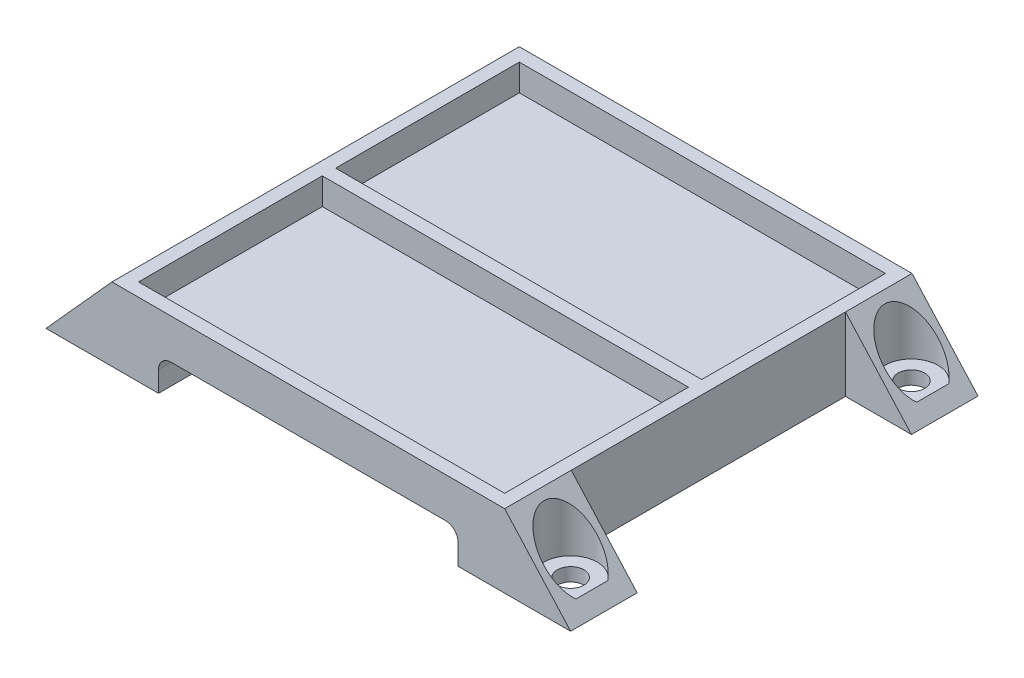
ISO-10303-21;
HEADER;
FILE_DESCRIPTION(('STEP AP214'),'2;1');
FILE_NAME('part.step','',(''),(''),'','','');
FILE_SCHEMA(('AUTOMOTIVE_DESIGN { 1 0 10303 214 1 1 1 1 }'));
ENDSEC;
DATA;
#1=APPLICATION_CONTEXT('core data for automotive mechanical design processes');
#2=APPLICATION_PROTOCOL_DEFINITION('international standard','automotive_design',2000,#1);
#3=PRODUCT_CONTEXT('',#1,'mechanical');
#4=PRODUCT('Part','Part','',(#3));
#5=PRODUCT_RELATED_PRODUCT_CATEGORY('part','',(#4));
#6=PRODUCT_DEFINITION_FORMATION('','',#4);
#7=PRODUCT_DEFINITION_CONTEXT('part definition',#1,'design');
#8=PRODUCT_DEFINITION('design','',#6,#7);
#9=PRODUCT_DEFINITION_SHAPE('','',#8);
#10=(LENGTH_UNIT() NAMED_UNIT(*) SI_UNIT(.MILLI.,.METRE.));
#11=(NAMED_UNIT(*) PLANE_ANGLE_UNIT() SI_UNIT($,.RADIAN.));
#12=(NAMED_UNIT(*) SI_UNIT($,.STERADIAN.) SOLID_ANGLE_UNIT());
#13=UNCERTAINTY_MEASURE_WITH_UNIT(LENGTH_MEASURE(1.E-05),#10,'distance_accuracy_value','');
#14=(GEOMETRIC_REPRESENTATION_CONTEXT(3) GLOBAL_UNCERTAINTY_ASSIGNED_CONTEXT((#13)) GLOBAL_UNIT_ASSIGNED_CONTEXT((#10,
#11,#12)) REPRESENTATION_CONTEXT('',''));
#15=CARTESIAN_POINT('',(0.,0.,0.));
#16=DIRECTION('',(0.,0.,1.));
#17=DIRECTION('',(1.,0.,0.));
#18=AXIS2_PLACEMENT_3D('',#15,#16,#17);
#19=CARTESIAN_POINT('',(-37.465,5.08,0.));
#20=DIRECTION('',(-1.,0.,0.));
#21=DIRECTION('',(0.,0.,1.));
#22=AXIS2_PLACEMENT_3D('',#19,#20,#21);
#23=PLANE('',#22);
#24=DIRECTION('',(0.,0.,-1.));
#25=VECTOR('',#24,1.);
#26=CARTESIAN_POINT('',(-37.465,-8.89,20.066));
#27=LINE('',#26,#25);
#28=CARTESIAN_POINT('',(-37.465,-8.89,7.366));
#29=VERTEX_POINT('',#28);
#30=CARTESIAN_POINT('',(-37.465,-8.89,-44.958));
#31=VERTEX_POINT('',#30);
#32=EDGE_CURVE('E462',#29,#31,#27,.T.);
#33=ORIENTED_EDGE('',*,*,#32,.F.);
#34=DIRECTION('',(0.,-1.,0.));
#35=VECTOR('',#34,1.);
#36=CARTESIAN_POINT('',(-37.465,-8.89,7.366));
#37=LINE('',#36,#35);
#38=CARTESIAN_POINT('',(-37.465,5.08,7.366));
#39=VERTEX_POINT('',#38);
#40=EDGE_CURVE('E442',#39,#29,#37,.T.);
#41=ORIENTED_EDGE('',*,*,#40,.F.);
#42=DIRECTION('',(0.,0.,-1.));
#43=VECTOR('',#42,1.);
#44=CARTESIAN_POINT('',(-37.465,5.08,0.));
#45=LINE('',#44,#43);
#46=CARTESIAN_POINT('',(-37.465,5.08,-44.958));
#47=VERTEX_POINT('',#46);
#48=EDGE_CURVE('E299',#39,#47,#45,.T.);
#49=ORIENTED_EDGE('',*,*,#48,.T.);
#50=DIRECTION('',(0.,1.,0.));
#51=VECTOR('',#50,1.);
#52=CARTESIAN_POINT('',(-37.465,5.08,-44.958));
#53=LINE('',#52,#51);
#54=EDGE_CURVE('E447',#31,#47,#53,.T.);
#55=ORIENTED_EDGE('',*,*,#54,.F.);
#56=EDGE_LOOP('',(#33,#41,#49,#55));
#57=FACE_BOUND('',#56,.T.);
#58=ADVANCED_FACE('F38',(#57),#23,.T.);
#59=CARTESIAN_POINT('',(37.465,5.08,0.));
#60=DIRECTION('',(-1.,0.,0.));
#61=DIRECTION('',(0.,0.,1.));
#62=AXIS2_PLACEMENT_3D('',#59,#60,#61);
#63=PLANE('',#62);
#64=DIRECTION('',(0.,1.,0.));
#65=VECTOR('',#64,1.);
#66=CARTESIAN_POINT('',(37.465,-8.89,7.366));
#67=LINE('',#66,#65);
#68=CARTESIAN_POINT('',(37.465,-8.89,7.366));
#69=VERTEX_POINT('',#68);
#70=CARTESIAN_POINT('',(37.465,5.08,7.366));
#71=VERTEX_POINT('',#70);
#72=EDGE_CURVE('E452',#69,#71,#67,.T.);
#73=ORIENTED_EDGE('',*,*,#72,.F.);
#74=DIRECTION('',(0.,0.,1.));
#75=VECTOR('',#74,1.);
#76=CARTESIAN_POINT('',(37.465,-8.89,20.066));
#77=LINE('',#76,#75);
#78=CARTESIAN_POINT('',(37.465,-8.89,-44.958));
#79=VERTEX_POINT('',#78);
#80=EDGE_CURVE('E478',#79,#69,#77,.T.);
#81=ORIENTED_EDGE('',*,*,#80,.F.);
#82=DIRECTION('',(0.,-1.,0.));
#83=VECTOR('',#82,1.);
#84=CARTESIAN_POINT('',(37.465,-8.89,-44.958));
#85=LINE('',#84,#83);
#86=CARTESIAN_POINT('',(37.465,5.08,-44.958));
#87=VERTEX_POINT('',#86);
#88=EDGE_CURVE('E457',#87,#79,#85,.T.);
#89=ORIENTED_EDGE('',*,*,#88,.F.);
#90=DIRECTION('',(0.,0.,-1.));
#91=VECTOR('',#90,1.);
#92=CARTESIAN_POINT('',(37.465,5.08,0.));
#93=LINE('',#92,#91);
#94=EDGE_CURVE('E293',#71,#87,#93,.T.);
#95=ORIENTED_EDGE('',*,*,#94,.F.);
#96=EDGE_LOOP('',(#73,#81,#89,#95));
#97=FACE_BOUND('',#96,.T.);
#98=ADVANCED_FACE('F505',(#97),#63,.F.);
#99=CARTESIAN_POINT('',(0.,-2.54,0.));
#100=DIRECTION('',(0.,1.,0.));
#101=DIRECTION('',(0.,0.,1.));
#102=AXIS2_PLACEMENT_3D('',#99,#100,#101);
#103=PLANE('',#102);
#104=DIRECTION('',(-1.,0.,0.));
#105=VECTOR('',#104,1.);
#106=CARTESIAN_POINT('',(-37.465,-2.54,20.066));
#107=LINE('',#106,#105);
#108=CARTESIAN_POINT('',(26.195,-2.54,20.066));
#109=VERTEX_POINT('',#108);
#110=CARTESIAN_POINT('',(-26.195,-2.54,20.066));
#111=VERTEX_POINT('',#110);
#112=EDGE_CURVE('E275',#109,#111,#107,.T.);
#113=ORIENTED_EDGE('',*,*,#112,.T.);
#114=DIRECTION('',(0.,0.,1.));
#115=VECTOR('',#114,1.);
#116=CARTESIAN_POINT('',(-26.195,-2.54,-57.658));
#117=LINE('',#116,#115);
#118=CARTESIAN_POINT('',(-26.195,-2.54,-57.658));
#119=VERTEX_POINT('',#118);
#120=EDGE_CURVE('E253',#111,#119,#117,.F.);
#121=ORIENTED_EDGE('',*,*,#120,.T.);
#122=DIRECTION('',(1.,0.,0.));
#123=VECTOR('',#122,1.);
#124=CARTESIAN_POINT('',(-37.465,-2.54,-57.658));
#125=LINE('',#124,#123);
#126=CARTESIAN_POINT('',(26.195,-2.54,-57.658));
#127=VERTEX_POINT('',#126);
#128=EDGE_CURVE('E266',#119,#127,#125,.T.);
#129=ORIENTED_EDGE('',*,*,#128,.T.);
#130=DIRECTION('',(0.,0.,-1.));
#131=VECTOR('',#130,1.);
#132=CARTESIAN_POINT('',(26.195,-2.54,20.066));
#133=LINE('',#132,#131);
#134=EDGE_CURVE('E245',#127,#109,#133,.F.);
#135=ORIENTED_EDGE('',*,*,#134,.T.);
#136=EDGE_LOOP('',(#113,#121,#129,#135));
#137=FACE_BOUND('',#136,.T.);
#138=ADVANCED_FACE('F273',(#137),#103,.F.);
#139=CARTESIAN_POINT('',(0.,5.08,-17.526));
#140=DIRECTION('',(0.,0.,-1.));
#141=DIRECTION('',(-1.,0.,0.));
#142=AXIS2_PLACEMENT_3D('',#139,#140,#141);
#143=PLANE('',#142);
#144=DIRECTION('',(1.,0.,0.));
#145=VECTOR('',#144,1.);
#146=CARTESIAN_POINT('',(0.,0.,-17.526));
#147=LINE('',#146,#145);
#148=CARTESIAN_POINT('',(-34.925,0.,-17.526));
#149=VERTEX_POINT('',#148);
#150=CARTESIAN_POINT('',(34.925,0.,-17.526));
#151=VERTEX_POINT('',#150);
#152=EDGE_CURVE('E336',#149,#151,#147,.T.);
#153=ORIENTED_EDGE('',*,*,#152,.T.);
#154=DIRECTION('',(0.,-1.,0.));
#155=VECTOR('',#154,1.);
#156=CARTESIAN_POINT('',(34.925,5.08,-17.526));
#157=LINE('',#156,#155);
#158=CARTESIAN_POINT('',(34.925,5.08,-17.526));
#159=VERTEX_POINT('',#158);
#160=EDGE_CURVE('E355',#159,#151,#157,.T.);
#161=ORIENTED_EDGE('',*,*,#160,.F.);
#162=DIRECTION('',(1.,0.,0.));
#163=VECTOR('',#162,1.);
#164=CARTESIAN_POINT('',(0.,5.08,-17.526));
#165=LINE('',#164,#163);
#166=CARTESIAN_POINT('',(-34.925,5.08,-17.526));
#167=VERTEX_POINT('',#166);
#168=EDGE_CURVE('E313',#167,#159,#165,.T.);
#169=ORIENTED_EDGE('',*,*,#168,.F.);
#170=DIRECTION('',(0.,-1.,0.));
#171=VECTOR('',#170,1.);
#172=CARTESIAN_POINT('',(-34.925,5.08,-17.526));
#173=LINE('',#172,#171);
#174=EDGE_CURVE('E345',#167,#149,#173,.T.);
#175=ORIENTED_EDGE('',*,*,#174,.T.);
#176=EDGE_LOOP('',(#153,#161,#169,#175));
#177=FACE_BOUND('',#176,.T.);
#178=ADVANCED_FACE('F647',(#177),#143,.F.);
#179=CARTESIAN_POINT('',(34.925,5.08,0.));
#180=DIRECTION('',(1.,0.,0.));
#181=DIRECTION('',(0.,0.,-1.));
#182=AXIS2_PLACEMENT_3D('',#179,#180,#181);
#183=PLANE('',#182);
#184=DIRECTION('',(0.,0.,1.));
#185=VECTOR('',#184,1.);
#186=CARTESIAN_POINT('',(34.925,0.,0.));
#187=LINE('',#186,#185);
#188=CARTESIAN_POINT('',(34.925,0.,17.526));
#189=VERTEX_POINT('',#188);
#190=EDGE_CURVE('E339',#151,#189,#187,.T.);
#191=ORIENTED_EDGE('',*,*,#190,.T.);
#192=DIRECTION('',(0.,-1.,0.));
#193=VECTOR('',#192,1.);
#194=CARTESIAN_POINT('',(34.925,5.08,17.526));
#195=LINE('',#194,#193);
#196=CARTESIAN_POINT('',(34.925,5.08,17.526));
#197=VERTEX_POINT('',#196);
#198=EDGE_CURVE('E352',#197,#189,#195,.T.);
#199=ORIENTED_EDGE('',*,*,#198,.F.);
#200=DIRECTION('',(0.,0.,1.));
#201=VECTOR('',#200,1.);
#202=CARTESIAN_POINT('',(34.925,5.08,0.));
#203=LINE('',#202,#201);
#204=EDGE_CURVE('E316',#159,#197,#203,.T.);
#205=ORIENTED_EDGE('',*,*,#204,.F.);
#206=ORIENTED_EDGE('',*,*,#160,.T.);
#207=EDGE_LOOP('',(#191,#199,#205,#206));
#208=FACE_BOUND('',#207,.T.);
#209=ADVANCED_FACE('F661',(#208),#183,.F.);
#210=CARTESIAN_POINT('',(0.,5.08,17.526));
#211=DIRECTION('',(0.,0.,-1.));
#212=DIRECTION('',(-1.,0.,0.));
#213=AXIS2_PLACEMENT_3D('',#210,#211,#212);
#214=PLANE('',#213);
#215=DIRECTION('',(1.,0.,0.));
#216=VECTOR('',#215,1.);
#217=CARTESIAN_POINT('',(0.,0.,17.526));
#218=LINE('',#217,#216);
#219=CARTESIAN_POINT('',(-34.925,0.,17.526));
#220=VERTEX_POINT('',#219);
#221=EDGE_CURVE('E342',#220,#189,#218,.T.);
#222=ORIENTED_EDGE('',*,*,#221,.F.);
#223=DIRECTION('',(0.,-1.,0.));
#224=VECTOR('',#223,1.);
#225=CARTESIAN_POINT('',(-34.925,5.08,17.526));
#226=LINE('',#225,#224);
#227=CARTESIAN_POINT('',(-34.925,5.08,17.526));
#228=VERTEX_POINT('',#227);
#229=EDGE_CURVE('E348',#228,#220,#226,.T.);
#230=ORIENTED_EDGE('',*,*,#229,.F.);
#231=DIRECTION('',(1.,0.,0.));
#232=VECTOR('',#231,1.);
#233=CARTESIAN_POINT('',(0.,5.08,17.526));
#234=LINE('',#233,#232);
#235=EDGE_CURVE('E318',#228,#197,#234,.T.);
#236=ORIENTED_EDGE('',*,*,#235,.T.);
#237=ORIENTED_EDGE('',*,*,#198,.T.);
#238=EDGE_LOOP('',(#222,#230,#236,#237));
#239=FACE_BOUND('',#238,.T.);
#240=ADVANCED_FACE('F658',(#239),#214,.T.);
#241=CARTESIAN_POINT('',(34.925,5.08,0.));
#242=DIRECTION('',(-1.,0.,0.));
#243=DIRECTION('',(0.,0.,1.));
#244=AXIS2_PLACEMENT_3D('',#241,#242,#243);
#245=PLANE('',#244);
#246=DIRECTION('',(0.,0.,-1.));
#247=VECTOR('',#246,1.);
#248=CARTESIAN_POINT('',(34.925,0.,0.));
#249=LINE('',#248,#247);
#250=CARTESIAN_POINT('',(34.925,0.,-20.066));
#251=VERTEX_POINT('',#250);
#252=CARTESIAN_POINT('',(34.925,0.,-55.118));
#253=VERTEX_POINT('',#252);
#254=EDGE_CURVE('E289',#251,#253,#249,.T.);
#255=ORIENTED_EDGE('',*,*,#254,.F.);
#256=DIRECTION('',(0.,-1.,0.));
#257=VECTOR('',#256,1.);
#258=CARTESIAN_POINT('',(34.925,5.08,-20.066));
#259=LINE('',#258,#257);
#260=CARTESIAN_POINT('',(34.925,5.08,-20.066));
#261=VERTEX_POINT('',#260);
#262=EDGE_CURVE('E349',#261,#251,#259,.T.);
#263=ORIENTED_EDGE('',*,*,#262,.F.);
#264=DIRECTION('',(0.,0.,-1.));
#265=VECTOR('',#264,1.);
#266=CARTESIAN_POINT('',(34.925,5.08,0.));
#267=LINE('',#266,#265);
#268=CARTESIAN_POINT('',(34.925,5.08,-55.118));
#269=VERTEX_POINT('',#268);
#270=EDGE_CURVE('E302',#261,#269,#267,.T.);
#271=ORIENTED_EDGE('',*,*,#270,.T.);
#272=DIRECTION('',(0.,-1.,0.));
#273=VECTOR('',#272,1.);
#274=CARTESIAN_POINT('',(34.925,5.08,-55.118));
#275=LINE('',#274,#273);
#276=EDGE_CURVE('E324',#269,#253,#275,.T.);
#277=ORIENTED_EDGE('',*,*,#276,.T.);
#278=EDGE_LOOP('',(#255,#263,#271,#277));
#279=FACE_BOUND('',#278,.T.);
#280=ADVANCED_FACE('F560',(#279),#245,.T.);
#281=CARTESIAN_POINT('',(0.,5.08,-20.066));
#282=DIRECTION('',(0.,0.,-1.));
#283=DIRECTION('',(-1.,0.,0.));
#284=AXIS2_PLACEMENT_3D('',#281,#282,#283);
#285=PLANE('',#284);
#286=DIRECTION('',(1.,0.,0.));
#287=VECTOR('',#286,1.);
#288=CARTESIAN_POINT('',(0.,0.,-20.066));
#289=LINE('',#288,#287);
#290=CARTESIAN_POINT('',(-34.925,0.,-20.066));
#291=VERTEX_POINT('',#290);
#292=EDGE_CURVE('E327',#291,#251,#289,.T.);
#293=ORIENTED_EDGE('',*,*,#292,.F.);
#294=DIRECTION('',(0.,-1.,0.));
#295=VECTOR('',#294,1.);
#296=CARTESIAN_POINT('',(-34.925,5.08,-20.066));
#297=LINE('',#296,#295);
#298=CARTESIAN_POINT('',(-34.925,5.08,-20.066));
#299=VERTEX_POINT('',#298);
#300=EDGE_CURVE('E362',#299,#291,#297,.T.);
#301=ORIENTED_EDGE('',*,*,#300,.F.);
#302=DIRECTION('',(1.,0.,0.));
#303=VECTOR('',#302,1.);
#304=CARTESIAN_POINT('',(0.,5.08,-20.066));
#305=LINE('',#304,#303);
#306=EDGE_CURVE('E305',#299,#261,#305,.T.);
#307=ORIENTED_EDGE('',*,*,#306,.T.);
#308=ORIENTED_EDGE('',*,*,#262,.T.);
#309=EDGE_LOOP('',(#293,#301,#307,#308));
#310=FACE_BOUND('',#309,.T.);
#311=ADVANCED_FACE('F673',(#310),#285,.T.);
#312=CARTESIAN_POINT('',(-34.925,5.08,0.));
#313=DIRECTION('',(-1.,0.,0.));
#314=DIRECTION('',(0.,0.,1.));
#315=AXIS2_PLACEMENT_3D('',#312,#313,#314);
#316=PLANE('',#315);
#317=DIRECTION('',(0.,0.,-1.));
#318=VECTOR('',#317,1.);
#319=CARTESIAN_POINT('',(-34.925,0.,0.));
#320=LINE('',#319,#318);
#321=CARTESIAN_POINT('',(-34.925,0.,-55.118));
#322=VERTEX_POINT('',#321);
#323=EDGE_CURVE('E330',#291,#322,#320,.T.);
#324=ORIENTED_EDGE('',*,*,#323,.T.);
#325=DIRECTION('',(0.,-1.,0.));
#326=VECTOR('',#325,1.);
#327=CARTESIAN_POINT('',(-34.925,5.08,-55.118));
#328=LINE('',#327,#326);
#329=CARTESIAN_POINT('',(-34.925,5.08,-55.118));
#330=VERTEX_POINT('',#329);
#331=EDGE_CURVE('E360',#330,#322,#328,.T.);
#332=ORIENTED_EDGE('',*,*,#331,.F.);
#333=DIRECTION('',(0.,0.,-1.));
#334=VECTOR('',#333,1.);
#335=CARTESIAN_POINT('',(-34.925,5.08,0.));
#336=LINE('',#335,#334);
#337=EDGE_CURVE('E308',#299,#330,#336,.T.);
#338=ORIENTED_EDGE('',*,*,#337,.F.);
#339=ORIENTED_EDGE('',*,*,#300,.T.);
#340=EDGE_LOOP('',(#324,#332,#338,#339));
#341=FACE_BOUND('',#340,.T.);
#342=ADVANCED_FACE('F566',(#341),#316,.F.);
#343=CARTESIAN_POINT('',(0.,5.08,20.066));
#344=DIRECTION('',(0.,0.,-1.));
#345=DIRECTION('',(-1.,0.,0.));
#346=AXIS2_PLACEMENT_3D('',#343,#344,#345);
#347=PLANE('',#346);
#348=DIRECTION('',(-1.,0.,0.));
#349=VECTOR('',#348,1.);
#350=CARTESIAN_POINT('',(37.465,-8.89,20.066));
#351=LINE('',#350,#349);
#352=CARTESIAN_POINT('',(50.0436444988406,-8.89,20.066));
#353=VERTEX_POINT('',#352);
#354=CARTESIAN_POINT('',(28.575,-8.89,20.066));
#355=VERTEX_POINT('',#354);
#356=EDGE_CURVE('E481',#353,#355,#351,.T.);
#357=ORIENTED_EDGE('',*,*,#356,.F.);
#358=DIRECTION('',(-0.669130606358854,0.743144825477398,0.));
#359=VECTOR('',#358,1.);
#360=CARTESIAN_POINT('',(50.165,-9.02477893833101,20.066));
#361=LINE('',#360,#359);
#362=CARTESIAN_POINT('',(37.4649999999999,5.08,20.066));
#363=VERTEX_POINT('',#362);
#364=EDGE_CURVE('E371',#353,#363,#361,.T.);
#365=ORIENTED_EDGE('',*,*,#364,.T.);
#366=DIRECTION('',(1.,0.,0.));
#367=VECTOR('',#366,1.);
#368=CARTESIAN_POINT('',(0.,5.08,20.066));
#369=LINE('',#368,#367);
#370=CARTESIAN_POINT('',(-37.4649999999999,5.08,20.066));
#371=VERTEX_POINT('',#370);
#372=EDGE_CURVE('E290',#371,#363,#369,.T.);
#373=ORIENTED_EDGE('',*,*,#372,.F.);
#374=DIRECTION('',(0.669130606358854,0.743144825477398,0.));
#375=VECTOR('',#374,1.);
#376=CARTESIAN_POINT('',(-50.165,-9.02477893833101,20.066));
#377=LINE('',#376,#375);
#378=CARTESIAN_POINT('',(-50.0436444988406,-8.89,20.066));
#379=VERTEX_POINT('',#378);
#380=EDGE_CURVE('E369',#371,#379,#377,.F.);
#381=ORIENTED_EDGE('',*,*,#380,.T.);
#382=DIRECTION('',(-1.,0.,0.));
#383=VECTOR('',#382,1.);
#384=CARTESIAN_POINT('',(-37.465,-8.89,20.066));
#385=LINE('',#384,#383);
#386=CARTESIAN_POINT('',(-28.575,-8.89,20.066));
#387=VERTEX_POINT('',#386);
#388=EDGE_CURVE('E469',#387,#379,#385,.T.);
#389=ORIENTED_EDGE('',*,*,#388,.F.);
#390=DIRECTION('',(0.,1.,0.));
#391=VECTOR('',#390,1.);
#392=CARTESIAN_POINT('',(-28.575,-8.89,20.066));
#393=LINE('',#392,#391);
#394=CARTESIAN_POINT('',(-28.575,-4.92,20.066));
#395=VERTEX_POINT('',#394);
#396=EDGE_CURVE('E472',#387,#395,#393,.T.);
#397=ORIENTED_EDGE('',*,*,#396,.T.);
#398=CARTESIAN_POINT('',(-26.195,-4.92,20.066));
#399=DIRECTION('',(0.,0.,-1.));
#400=DIRECTION('',(-1.,0.,0.));
#401=AXIS2_PLACEMENT_3D('',#398,#399,#400);
#402=CIRCLE('',#401,2.38);
#403=EDGE_CURVE('E257',#395,#111,#402,.T.);
#404=ORIENTED_EDGE('',*,*,#403,.T.);
#405=ORIENTED_EDGE('',*,*,#112,.F.);
#406=CARTESIAN_POINT('',(26.195,-4.92,20.066));
#407=DIRECTION('',(0.,0.,-1.));
#408=DIRECTION('',(-1.,0.,0.));
#409=AXIS2_PLACEMENT_3D('',#406,#407,#408);
#410=CIRCLE('',#409,2.38);
#411=CARTESIAN_POINT('',(28.575,-4.92,20.066));
#412=VERTEX_POINT('',#411);
#413=EDGE_CURVE('E11',#109,#412,#410,.T.);
#414=ORIENTED_EDGE('',*,*,#413,.T.);
#415=DIRECTION('',(0.,1.,0.));
#416=VECTOR('',#415,1.);
#417=CARTESIAN_POINT('',(28.575,-8.89,20.066));
#418=LINE('',#417,#416);
#419=EDGE_CURVE('E276',#355,#412,#418,.T.);
#420=ORIENTED_EDGE('',*,*,#419,.F.);
#421=EDGE_LOOP('',(#357,#365,#373,#381,#389,#397,#404,#405,#414,#420));
#422=FACE_BOUND('',#421,.T.);
#423=ADVANCED_FACE('F510',(#422),#347,.F.);
#424=CARTESIAN_POINT('',(0.,5.08,-57.658));
#425=DIRECTION('',(0.,0.,-1.));
#426=DIRECTION('',(-1.,0.,0.));
#427=AXIS2_PLACEMENT_3D('',#424,#425,#426);
#428=PLANE('',#427);
#429=DIRECTION('',(1.,0.,0.));
#430=VECTOR('',#429,1.);
#431=CARTESIAN_POINT('',(0.,5.08,-57.658));
#432=LINE('',#431,#430);
#433=CARTESIAN_POINT('',(-37.4649999999999,5.08,-57.658));
#434=VERTEX_POINT('',#433);
#435=CARTESIAN_POINT('',(37.4649999999999,5.08,-57.658));
#436=VERTEX_POINT('',#435);
#437=EDGE_CURVE('E297',#434,#436,#432,.T.);
#438=ORIENTED_EDGE('',*,*,#437,.T.);
#439=DIRECTION('',(-0.669130606358854,0.743144825477398,0.));
#440=VECTOR('',#439,1.);
#441=CARTESIAN_POINT('',(20.6905794381615,23.7098814049861,-57.658));
#442=LINE('',#441,#440);
#443=CARTESIAN_POINT('',(50.0436444988406,-8.89,-57.658));
#444=VERTEX_POINT('',#443);
#445=EDGE_CURVE('E391',#436,#444,#442,.F.);
#446=ORIENTED_EDGE('',*,*,#445,.T.);
#447=DIRECTION('',(1.,0.,0.));
#448=VECTOR('',#447,1.);
#449=CARTESIAN_POINT('',(37.465,-8.89,-57.658));
#450=LINE('',#449,#448);
#451=CARTESIAN_POINT('',(28.575,-8.89,-57.658));
#452=VERTEX_POINT('',#451);
#453=EDGE_CURVE('E284',#452,#444,#450,.T.);
#454=ORIENTED_EDGE('',*,*,#453,.F.);
#455=DIRECTION('',(0.,1.,0.));
#456=VECTOR('',#455,1.);
#457=CARTESIAN_POINT('',(28.575,-8.89,-57.658));
#458=LINE('',#457,#456);
#459=CARTESIAN_POINT('',(28.575,-4.92,-57.658));
#460=VERTEX_POINT('',#459);
#461=EDGE_CURVE('E270',#452,#460,#458,.T.);
#462=ORIENTED_EDGE('',*,*,#461,.T.);
#463=CARTESIAN_POINT('',(26.195,-4.92,-57.658));
#464=DIRECTION('',(0.,0.,-1.));
#465=DIRECTION('',(-1.,0.,0.));
#466=AXIS2_PLACEMENT_3D('',#463,#464,#465);
#467=CIRCLE('',#466,2.38);
#468=EDGE_CURVE('E46',#460,#127,#467,.F.);
#469=ORIENTED_EDGE('',*,*,#468,.T.);
#470=ORIENTED_EDGE('',*,*,#128,.F.);
#471=CARTESIAN_POINT('',(-26.195,-4.92,-57.658));
#472=DIRECTION('',(0.,0.,-1.));
#473=DIRECTION('',(-1.,0.,0.));
#474=AXIS2_PLACEMENT_3D('',#471,#472,#473);
#475=CIRCLE('',#474,2.38);
#476=CARTESIAN_POINT('',(-28.575,-4.92,-57.658));
#477=VERTEX_POINT('',#476);
#478=EDGE_CURVE('E259',#119,#477,#475,.F.);
#479=ORIENTED_EDGE('',*,*,#478,.T.);
#480=DIRECTION('',(0.,1.,0.));
#481=VECTOR('',#480,1.);
#482=CARTESIAN_POINT('',(-28.575,-8.89,-57.658));
#483=LINE('',#482,#481);
#484=CARTESIAN_POINT('',(-28.575,-8.89,-57.658));
#485=VERTEX_POINT('',#484);
#486=EDGE_CURVE('E475',#485,#477,#483,.T.);
#487=ORIENTED_EDGE('',*,*,#486,.F.);
#488=DIRECTION('',(1.,0.,0.));
#489=VECTOR('',#488,1.);
#490=CARTESIAN_POINT('',(-37.465,-8.89,-57.658));
#491=LINE('',#490,#489);
#492=CARTESIAN_POINT('',(-50.0436444988406,-8.89,-57.658));
#493=VERTEX_POINT('',#492);
#494=EDGE_CURVE('E465',#493,#485,#491,.T.);
#495=ORIENTED_EDGE('',*,*,#494,.F.);
#496=DIRECTION('',(-0.669130606358854,-0.743144825477398,0.));
#497=VECTOR('',#496,1.);
#498=CARTESIAN_POINT('',(-20.6905794381615,23.7098814049861,-57.658));
#499=LINE('',#498,#497);
#500=EDGE_CURVE('E389',#493,#434,#499,.F.);
#501=ORIENTED_EDGE('',*,*,#500,.T.);
#502=EDGE_LOOP('',(#438,#446,#454,#462,#469,#470,#479,#487,#495,#501));
#503=FACE_BOUND('',#502,.T.);
#504=ADVANCED_FACE('F265',(#503),#428,.T.);
#505=CARTESIAN_POINT('',(0.,5.08,-55.118));
#506=DIRECTION('',(0.,0.,-1.));
#507=DIRECTION('',(-1.,0.,0.));
#508=AXIS2_PLACEMENT_3D('',#505,#506,#507);
#509=PLANE('',#508);
#510=DIRECTION('',(1.,0.,0.));
#511=VECTOR('',#510,1.);
#512=CARTESIAN_POINT('',(0.,0.,-55.118));
#513=LINE('',#512,#511);
#514=EDGE_CURVE('E333',#322,#253,#513,.T.);
#515=ORIENTED_EDGE('',*,*,#514,.T.);
#516=ORIENTED_EDGE('',*,*,#276,.F.);
#517=DIRECTION('',(1.,0.,0.));
#518=VECTOR('',#517,1.);
#519=CARTESIAN_POINT('',(0.,5.08,-55.118));
#520=LINE('',#519,#518);
#521=EDGE_CURVE('E311',#330,#269,#520,.T.);
#522=ORIENTED_EDGE('',*,*,#521,.F.);
#523=ORIENTED_EDGE('',*,*,#331,.T.);
#524=EDGE_LOOP('',(#515,#516,#522,#523));
#525=FACE_BOUND('',#524,.T.);
#526=ADVANCED_FACE('F563',(#525),#509,.F.);
#527=CARTESIAN_POINT('',(-34.925,5.08,0.));
#528=DIRECTION('',(1.,0.,0.));
#529=DIRECTION('',(0.,0.,-1.));
#530=AXIS2_PLACEMENT_3D('',#527,#528,#529);
#531=PLANE('',#530);
#532=DIRECTION('',(0.,0.,1.));
#533=VECTOR('',#532,1.);
#534=CARTESIAN_POINT('',(-34.925,0.,0.));
#535=LINE('',#534,#533);
#536=EDGE_CURVE('E294',#149,#220,#535,.T.);
#537=ORIENTED_EDGE('',*,*,#536,.F.);
#538=ORIENTED_EDGE('',*,*,#174,.F.);
#539=DIRECTION('',(0.,0.,1.));
#540=VECTOR('',#539,1.);
#541=CARTESIAN_POINT('',(-34.925,5.08,0.));
#542=LINE('',#541,#540);
#543=EDGE_CURVE('E321',#167,#228,#542,.T.);
#544=ORIENTED_EDGE('',*,*,#543,.T.);
#545=ORIENTED_EDGE('',*,*,#229,.T.);
#546=EDGE_LOOP('',(#537,#538,#544,#545));
#547=FACE_BOUND('',#546,.T.);
#548=ADVANCED_FACE('F654',(#547),#531,.T.);
#549=CARTESIAN_POINT('',(0.,5.08,0.));
#550=DIRECTION('',(0.,1.,0.));
#551=DIRECTION('',(0.,0.,1.));
#552=AXIS2_PLACEMENT_3D('',#549,#550,#551);
#553=PLANE('',#552);
#554=ORIENTED_EDGE('',*,*,#372,.T.);
#555=DIRECTION('',(0.,0.,-1.));
#556=VECTOR('',#555,1.);
#557=CARTESIAN_POINT('',(37.4649999999999,5.08,7.366));
#558=LINE('',#557,#556);
#559=EDGE_CURVE('E382',#363,#71,#558,.T.);
#560=ORIENTED_EDGE('',*,*,#559,.T.);
#561=ORIENTED_EDGE('',*,*,#94,.T.);
#562=DIRECTION('',(0.,0.,-1.));
#563=VECTOR('',#562,1.);
#564=CARTESIAN_POINT('',(37.4649999999999,5.08,0.));
#565=LINE('',#564,#563);
#566=EDGE_CURVE('E379',#87,#436,#565,.T.);
#567=ORIENTED_EDGE('',*,*,#566,.T.);
#568=ORIENTED_EDGE('',*,*,#437,.F.);
#569=DIRECTION('',(0.,0.,1.));
#570=VECTOR('',#569,1.);
#571=CARTESIAN_POINT('',(-37.4649999999999,5.08,0.));
#572=LINE('',#571,#570);
#573=EDGE_CURVE('E373',#434,#47,#572,.T.);
#574=ORIENTED_EDGE('',*,*,#573,.T.);
#575=ORIENTED_EDGE('',*,*,#48,.F.);
#576=DIRECTION('',(0.,0.,1.));
#577=VECTOR('',#576,1.);
#578=CARTESIAN_POINT('',(-37.4649999999999,5.08,0.));
#579=LINE('',#578,#577);
#580=EDGE_CURVE('E376',#39,#371,#579,.T.);
#581=ORIENTED_EDGE('',*,*,#580,.T.);
#582=EDGE_LOOP('',(#554,#560,#561,#567,#568,#574,#575,#581));
#583=FACE_BOUND('',#582,.T.);
#584=ORIENTED_EDGE('',*,*,#270,.F.);
#585=ORIENTED_EDGE('',*,*,#306,.F.);
#586=ORIENTED_EDGE('',*,*,#337,.T.);
#587=ORIENTED_EDGE('',*,*,#521,.T.);
#588=EDGE_LOOP('',(#584,#585,#586,#587));
#589=FACE_BOUND('',#588,.T.);
#590=ORIENTED_EDGE('',*,*,#168,.T.);
#591=ORIENTED_EDGE('',*,*,#204,.T.);
#592=ORIENTED_EDGE('',*,*,#235,.F.);
#593=ORIENTED_EDGE('',*,*,#543,.F.);
#594=EDGE_LOOP('',(#590,#591,#592,#593));
#595=FACE_BOUND('',#594,.T.);
#596=ADVANCED_FACE('F498',(#583,#589,#595),#553,.T.);
#597=CARTESIAN_POINT('',(0.,0.,0.));
#598=DIRECTION('',(0.,1.,0.));
#599=DIRECTION('',(0.,0.,1.));
#600=AXIS2_PLACEMENT_3D('',#597,#598,#599);
#601=PLANE('',#600);
#602=ORIENTED_EDGE('',*,*,#152,.F.);
#603=ORIENTED_EDGE('',*,*,#536,.T.);
#604=ORIENTED_EDGE('',*,*,#221,.T.);
#605=ORIENTED_EDGE('',*,*,#190,.F.);
#606=EDGE_LOOP('',(#602,#603,#604,#605));
#607=FACE_BOUND('',#606,.T.);
#608=ADVANCED_FACE('F650',(#607),#601,.T.);
#609=ORIENTED_EDGE('',*,*,#292,.T.);
#610=ORIENTED_EDGE('',*,*,#254,.T.);
#611=ORIENTED_EDGE('',*,*,#514,.F.);
#612=ORIENTED_EDGE('',*,*,#323,.F.);
#613=EDGE_LOOP('',(#609,#610,#611,#612));
#614=FACE_BOUND('',#613,.T.);
#615=ADVANCED_FACE('F640',(#614),#601,.T.);
#616=CARTESIAN_POINT('',(28.575,-8.89,20.066));
#617=DIRECTION('',(1.,0.,0.));
#618=DIRECTION('',(0.,0.,-1.));
#619=AXIS2_PLACEMENT_3D('',#616,#617,#618);
#620=PLANE('',#619);
#621=ORIENTED_EDGE('',*,*,#419,.T.);
#622=DIRECTION('',(0.,0.,-1.));
#623=VECTOR('',#622,1.);
#624=CARTESIAN_POINT('',(28.575,-4.92,-57.658));
#625=LINE('',#624,#623);
#626=EDGE_CURVE('E255',#412,#460,#625,.T.);
#627=ORIENTED_EDGE('',*,*,#626,.T.);
#628=ORIENTED_EDGE('',*,*,#461,.F.);
#629=DIRECTION('',(0.,0.,-1.));
#630=VECTOR('',#629,1.);
#631=CARTESIAN_POINT('',(28.575,-8.89,20.066));
#632=LINE('',#631,#630);
#633=EDGE_CURVE('E281',#355,#452,#632,.T.);
#634=ORIENTED_EDGE('',*,*,#633,.F.);
#635=EDGE_LOOP('',(#621,#627,#628,#634));
#636=FACE_BOUND('',#635,.T.);
#637=ADVANCED_FACE('F279',(#636),#620,.F.);
#638=CARTESIAN_POINT('',(0.,-8.89,0.));
#639=DIRECTION('',(0.,1.,0.));
#640=DIRECTION('',(0.,0.,1.));
#641=AXIS2_PLACEMENT_3D('',#638,#639,#640);
#642=PLANE('',#641);
#643=CARTESIAN_POINT('',(43.6936444988406,-8.89,13.716));
#644=DIRECTION('',(0.,-1.,0.));
#645=DIRECTION('',(0.,0.,-1.));
#646=AXIS2_PLACEMENT_3D('',#643,#644,#645);
#647=CIRCLE('',#646,2.54);
#648=CARTESIAN_POINT('',(43.6936444988406,-8.89,11.176));
#649=VERTEX_POINT('',#648);
#650=EDGE_CURVE('E431',#649,#649,#647,.T.);
#651=ORIENTED_EDGE('',*,*,#650,.F.);
#652=EDGE_LOOP('',(#651));
#653=FACE_BOUND('',#652,.T.);
#654=CARTESIAN_POINT('',(43.6936444988406,-8.89,-51.308));
#655=DIRECTION('',(0.,-1.,0.));
#656=DIRECTION('',(0.,0.,-1.));
#657=AXIS2_PLACEMENT_3D('',#654,#655,#656);
#658=CIRCLE('',#657,2.54);
#659=CARTESIAN_POINT('',(43.6936444988406,-8.89,-53.848));
#660=VERTEX_POINT('',#659);
#661=EDGE_CURVE('E434',#660,#660,#658,.T.);
#662=ORIENTED_EDGE('',*,*,#661,.F.);
#663=EDGE_LOOP('',(#662));
#664=FACE_BOUND('',#663,.T.);
#665=DIRECTION('',(-1.,0.,0.));
#666=VECTOR('',#665,1.);
#667=CARTESIAN_POINT('',(50.165,-8.89,7.366));
#668=LINE('',#667,#666);
#669=CARTESIAN_POINT('',(50.0436444988406,-8.89,7.366));
#670=VERTEX_POINT('',#669);
#671=EDGE_CURVE('E455',#670,#69,#668,.T.);
#672=ORIENTED_EDGE('',*,*,#671,.F.);
#673=DIRECTION('',(0.,0.,1.));
#674=VECTOR('',#673,1.);
#675=CARTESIAN_POINT('',(50.0436444988406,-8.89,0.));
#676=LINE('',#675,#674);
#677=EDGE_CURVE('E367',#670,#353,#676,.T.);
#678=ORIENTED_EDGE('',*,*,#677,.T.);
#679=ORIENTED_EDGE('',*,*,#356,.T.);
#680=ORIENTED_EDGE('',*,*,#633,.T.);
#681=ORIENTED_EDGE('',*,*,#453,.T.);
#682=DIRECTION('',(0.,0.,-1.));
#683=VECTOR('',#682,1.);
#684=CARTESIAN_POINT('',(50.0436444988406,-8.89,0.));
#685=LINE('',#684,#683);
#686=CARTESIAN_POINT('',(50.0436444988406,-8.89,-44.958));
#687=VERTEX_POINT('',#686);
#688=EDGE_CURVE('E358',#444,#687,#685,.F.);
#689=ORIENTED_EDGE('',*,*,#688,.T.);
#690=DIRECTION('',(-1.,0.,0.));
#691=VECTOR('',#690,1.);
#692=CARTESIAN_POINT('',(50.165,-8.89,-44.958));
#693=LINE('',#692,#691);
#694=EDGE_CURVE('E460',#687,#79,#693,.T.);
#695=ORIENTED_EDGE('',*,*,#694,.T.);
#696=ORIENTED_EDGE('',*,*,#80,.T.);
#697=EDGE_LOOP('',(#672,#678,#679,#680,#681,#689,#695,#696));
#698=FACE_BOUND('',#697,.T.);
#699=ADVANCED_FACE('F487',(#653,#664,#698),#642,.F.);
#700=CARTESIAN_POINT('',(-28.575,-8.89,20.066));
#701=DIRECTION('',(-1.,0.,0.));
#702=DIRECTION('',(0.,0.,1.));
#703=AXIS2_PLACEMENT_3D('',#700,#701,#702);
#704=PLANE('',#703);
#705=ORIENTED_EDGE('',*,*,#486,.T.);
#706=DIRECTION('',(0.,0.,1.));
#707=VECTOR('',#706,1.);
#708=CARTESIAN_POINT('',(-28.575,-4.92,20.066));
#709=LINE('',#708,#707);
#710=EDGE_CURVE('E241',#477,#395,#709,.T.);
#711=ORIENTED_EDGE('',*,*,#710,.T.);
#712=ORIENTED_EDGE('',*,*,#396,.F.);
#713=DIRECTION('',(0.,0.,1.));
#714=VECTOR('',#713,1.);
#715=CARTESIAN_POINT('',(-28.575,-8.89,20.066));
#716=LINE('',#715,#714);
#717=EDGE_CURVE('E467',#485,#387,#716,.T.);
#718=ORIENTED_EDGE('',*,*,#717,.F.);
#719=EDGE_LOOP('',(#705,#711,#712,#718));
#720=FACE_BOUND('',#719,.T.);
#721=ADVANCED_FACE('F524',(#720),#704,.F.);
#722=CARTESIAN_POINT('',(0.,-8.89,0.));
#723=DIRECTION('',(0.,-1.,0.));
#724=DIRECTION('',(0.,0.,-1.));
#725=AXIS2_PLACEMENT_3D('',#722,#723,#724);
#726=PLANE('',#725);
#727=CARTESIAN_POINT('',(-43.6936444988406,-8.89,-51.308));
#728=DIRECTION('',(0.,-1.,0.));
#729=DIRECTION('',(0.,0.,-1.));
#730=AXIS2_PLACEMENT_3D('',#727,#728,#729);
#731=CIRCLE('',#730,2.54);
#732=CARTESIAN_POINT('',(-43.6936444988406,-8.89,-53.848));
#733=VERTEX_POINT('',#732);
#734=EDGE_CURVE('E430',#733,#733,#731,.T.);
#735=ORIENTED_EDGE('',*,*,#734,.F.);
#736=EDGE_LOOP('',(#735));
#737=FACE_BOUND('',#736,.T.);
#738=CARTESIAN_POINT('',(-43.6936444988406,-8.89,13.716));
#739=DIRECTION('',(0.,-1.,0.));
#740=DIRECTION('',(0.,0.,-1.));
#741=AXIS2_PLACEMENT_3D('',#738,#739,#740);
#742=CIRCLE('',#741,2.54);
#743=CARTESIAN_POINT('',(-43.6936444988406,-8.89,11.176));
#744=VERTEX_POINT('',#743);
#745=EDGE_CURVE('E435',#744,#744,#742,.T.);
#746=ORIENTED_EDGE('',*,*,#745,.F.);
#747=EDGE_LOOP('',(#746));
#748=FACE_BOUND('',#747,.T.);
#749=ORIENTED_EDGE('',*,*,#388,.T.);
#750=DIRECTION('',(0.,0.,1.));
#751=VECTOR('',#750,1.);
#752=CARTESIAN_POINT('',(-50.0436444988406,-8.89,0.));
#753=LINE('',#752,#751);
#754=CARTESIAN_POINT('',(-50.0436444988406,-8.89,7.366));
#755=VERTEX_POINT('',#754);
#756=EDGE_CURVE('E395',#379,#755,#753,.F.);
#757=ORIENTED_EDGE('',*,*,#756,.T.);
#758=DIRECTION('',(1.,0.,0.));
#759=VECTOR('',#758,1.);
#760=CARTESIAN_POINT('',(-50.165,-8.89,7.366));
#761=LINE('',#760,#759);
#762=EDGE_CURVE('E445',#755,#29,#761,.T.);
#763=ORIENTED_EDGE('',*,*,#762,.T.);
#764=ORIENTED_EDGE('',*,*,#32,.T.);
#765=DIRECTION('',(1.,0.,0.));
#766=VECTOR('',#765,1.);
#767=CARTESIAN_POINT('',(-50.165,-8.89,-44.958));
#768=LINE('',#767,#766);
#769=CARTESIAN_POINT('',(-50.0436444988406,-8.89,-44.958));
#770=VERTEX_POINT('',#769);
#771=EDGE_CURVE('E450',#770,#31,#768,.T.);
#772=ORIENTED_EDGE('',*,*,#771,.F.);
#773=DIRECTION('',(0.,0.,1.));
#774=VECTOR('',#773,1.);
#775=CARTESIAN_POINT('',(-50.0436444988406,-8.89,0.));
#776=LINE('',#775,#774);
#777=EDGE_CURVE('E393',#770,#493,#776,.F.);
#778=ORIENTED_EDGE('',*,*,#777,.T.);
#779=ORIENTED_EDGE('',*,*,#494,.T.);
#780=ORIENTED_EDGE('',*,*,#717,.T.);
#781=EDGE_LOOP('',(#749,#757,#763,#764,#772,#778,#779,#780));
#782=FACE_BOUND('',#781,.T.);
#783=ADVANCED_FACE('F517',(#737,#748,#782),#726,.T.);
#784=CARTESIAN_POINT('',(50.165,-8.89,-44.958));
#785=DIRECTION('',(0.,0.,-1.));
#786=DIRECTION('',(-1.,0.,0.));
#787=AXIS2_PLACEMENT_3D('',#784,#785,#786);
#788=PLANE('',#787);
#789=ORIENTED_EDGE('',*,*,#694,.F.);
#790=DIRECTION('',(0.669130606358854,-0.743144825477398,0.));
#791=VECTOR('',#790,1.);
#792=CARTESIAN_POINT('',(50.165,-9.02477893833101,-44.958));
#793=LINE('',#792,#791);
#794=EDGE_CURVE('E387',#687,#87,#793,.F.);
#795=ORIENTED_EDGE('',*,*,#794,.T.);
#796=ORIENTED_EDGE('',*,*,#88,.T.);
#797=EDGE_LOOP('',(#789,#795,#796));
#798=FACE_BOUND('',#797,.T.);
#799=ADVANCED_FACE('F494',(#798),#788,.F.);
#800=CARTESIAN_POINT('',(50.165,-8.89,7.366));
#801=DIRECTION('',(0.,0.,1.));
#802=DIRECTION('',(1.,0.,0.));
#803=AXIS2_PLACEMENT_3D('',#800,#801,#802);
#804=PLANE('',#803);
#805=ORIENTED_EDGE('',*,*,#72,.T.);
#806=DIRECTION('',(0.669130606358854,-0.743144825477398,0.));
#807=VECTOR('',#806,1.);
#808=CARTESIAN_POINT('',(50.165,-9.02477893833101,7.366));
#809=LINE('',#808,#807);
#810=EDGE_CURVE('E385',#71,#670,#809,.T.);
#811=ORIENTED_EDGE('',*,*,#810,.T.);
#812=ORIENTED_EDGE('',*,*,#671,.T.);
#813=EDGE_LOOP('',(#805,#811,#812));
#814=FACE_BOUND('',#813,.T.);
#815=ADVANCED_FACE('F549',(#814),#804,.F.);
#816=CARTESIAN_POINT('',(-50.165,5.08,-44.958));
#817=DIRECTION('',(0.,0.,-1.));
#818=DIRECTION('',(-1.,0.,0.));
#819=AXIS2_PLACEMENT_3D('',#816,#817,#818);
#820=PLANE('',#819);
#821=ORIENTED_EDGE('',*,*,#54,.T.);
#822=DIRECTION('',(0.669130606358854,0.743144825477398,0.));
#823=VECTOR('',#822,1.);
#824=CARTESIAN_POINT('',(-50.165,-9.02477893833101,-44.958));
#825=LINE('',#824,#823);
#826=EDGE_CURVE('E399',#47,#770,#825,.F.);
#827=ORIENTED_EDGE('',*,*,#826,.T.);
#828=ORIENTED_EDGE('',*,*,#771,.T.);
#829=EDGE_LOOP('',(#821,#827,#828));
#830=FACE_BOUND('',#829,.T.);
#831=ADVANCED_FACE('F538',(#830),#820,.F.);
#832=CARTESIAN_POINT('',(-50.165,-8.89,7.366));
#833=DIRECTION('',(0.,0.,1.));
#834=DIRECTION('',(1.,0.,0.));
#835=AXIS2_PLACEMENT_3D('',#832,#833,#834);
#836=PLANE('',#835);
#837=ORIENTED_EDGE('',*,*,#762,.F.);
#838=DIRECTION('',(-0.669130606358854,-0.743144825477398,0.));
#839=VECTOR('',#838,1.);
#840=CARTESIAN_POINT('',(-50.165,-9.02477893833101,7.366));
#841=LINE('',#840,#839);
#842=EDGE_CURVE('E397',#755,#39,#841,.F.);
#843=ORIENTED_EDGE('',*,*,#842,.T.);
#844=ORIENTED_EDGE('',*,*,#40,.T.);
#845=EDGE_LOOP('',(#837,#843,#844));
#846=FACE_BOUND('',#845,.T.);
#847=ADVANCED_FACE('F541',(#846),#836,.F.);
#848=CARTESIAN_POINT('',(50.165,-9.02477893833101,0.));
#849=DIRECTION('',(0.743144825477398,0.669130606358854,0.));
#850=DIRECTION('',(0.,0.,-1.));
#851=AXIS2_PLACEMENT_3D('',#848,#849,#850);
#852=PLANE('',#851);
#853=CARTESIAN_POINT('',(43.6936444988406,-1.83761053083455,13.716));
#854=DIRECTION('',(0.743144825477398,0.669130606358854,0.));
#855=DIRECTION('',(0.669130606358854,-0.743144825477398,0.));
#856=AXIS2_PLACEMENT_3D('',#853,#854,#855);
#857=ELLIPSE('',#856,7.59194087331225,5.08);
#858=CARTESIAN_POINT('',(47.7566182263241,-6.35,10.6666321163594));
#859=VERTEX_POINT('',#858);
#860=CARTESIAN_POINT('',(47.7566182263241,-6.35,16.7653678836406));
#861=VERTEX_POINT('',#860);
#862=EDGE_CURVE('E235',#859,#861,#857,.T.);
#863=ORIENTED_EDGE('',*,*,#862,.F.);
#864=DIRECTION('',(0.,0.,-1.));
#865=VECTOR('',#864,1.);
#866=CARTESIAN_POINT('',(47.7566182263241,-6.35,0.));
#867=LINE('',#866,#865);
#868=EDGE_CURVE('E222',#861,#859,#867,.T.);
#869=ORIENTED_EDGE('',*,*,#868,.F.);
#870=EDGE_LOOP('',(#863,#869));
#871=FACE_BOUND('',#870,.T.);
#872=ORIENTED_EDGE('',*,*,#810,.F.);
#873=ORIENTED_EDGE('',*,*,#559,.F.);
#874=ORIENTED_EDGE('',*,*,#364,.F.);
#875=ORIENTED_EDGE('',*,*,#677,.F.);
#876=EDGE_LOOP('',(#872,#873,#874,#875));
#877=FACE_BOUND('',#876,.T.);
#878=ADVANCED_FACE('F239',(#871,#877),#852,.T.);
#879=CARTESIAN_POINT('',(50.165,-9.02477893833101,0.));
#880=DIRECTION('',(-0.743144825477398,-0.669130606358854,0.));
#881=DIRECTION('',(0.,0.,1.));
#882=AXIS2_PLACEMENT_3D('',#879,#880,#881);
#883=PLANE('',#882);
#884=CARTESIAN_POINT('',(43.6936444988406,-1.83761053083455,-51.308));
#885=DIRECTION('',(-0.743144825477398,-0.669130606358854,0.));
#886=DIRECTION('',(0.669130606358854,-0.743144825477398,0.));
#887=AXIS2_PLACEMENT_3D('',#884,#885,#886);
#888=ELLIPSE('',#887,7.59194087331225,5.08);
#889=CARTESIAN_POINT('',(47.7566182263241,-6.35,-54.3573678836406));
#890=VERTEX_POINT('',#889);
#891=CARTESIAN_POINT('',(47.7566182263241,-6.35,-48.2586321163594));
#892=VERTEX_POINT('',#891);
#893=EDGE_CURVE('E242',#890,#892,#888,.F.);
#894=ORIENTED_EDGE('',*,*,#893,.F.);
#895=DIRECTION('',(0.,0.,1.));
#896=VECTOR('',#895,1.);
#897=CARTESIAN_POINT('',(47.7566182263241,-6.35,0.));
#898=LINE('',#897,#896);
#899=EDGE_CURVE('E406',#892,#890,#898,.F.);
#900=ORIENTED_EDGE('',*,*,#899,.F.);
#901=EDGE_LOOP('',(#894,#900));
#902=FACE_BOUND('',#901,.T.);
#903=ORIENTED_EDGE('',*,*,#445,.F.);
#904=ORIENTED_EDGE('',*,*,#566,.F.);
#905=ORIENTED_EDGE('',*,*,#794,.F.);
#906=ORIENTED_EDGE('',*,*,#688,.F.);
#907=EDGE_LOOP('',(#903,#904,#905,#906));
#908=FACE_BOUND('',#907,.T.);
#909=ADVANCED_FACE('F491',(#902,#908),#883,.F.);
#910=CARTESIAN_POINT('',(-50.165,-9.02477893833101,0.));
#911=DIRECTION('',(0.743144825477398,-0.669130606358854,0.));
#912=DIRECTION('',(0.,0.,-1.));
#913=AXIS2_PLACEMENT_3D('',#910,#911,#912);
#914=PLANE('',#913);
#915=CARTESIAN_POINT('',(-43.6936444988406,-1.83761053083455,13.716));
#916=DIRECTION('',(0.743144825477398,-0.669130606358854,0.));
#917=DIRECTION('',(-0.669130606358854,-0.743144825477398,0.));
#918=AXIS2_PLACEMENT_3D('',#915,#916,#917);
#919=ELLIPSE('',#918,7.59194087331225,5.08);
#920=CARTESIAN_POINT('',(-47.7566182263241,-6.35,16.7653678836406));
#921=VERTEX_POINT('',#920);
#922=CARTESIAN_POINT('',(-47.7566182263241,-6.35,10.6666321163594));
#923=VERTEX_POINT('',#922);
#924=EDGE_CURVE('E248',#921,#923,#919,.F.);
#925=ORIENTED_EDGE('',*,*,#924,.F.);
#926=DIRECTION('',(0.,0.,-1.));
#927=VECTOR('',#926,1.);
#928=CARTESIAN_POINT('',(-47.7566182263241,-6.35,0.));
#929=LINE('',#928,#927);
#930=EDGE_CURVE('E410',#923,#921,#929,.F.);
#931=ORIENTED_EDGE('',*,*,#930,.F.);
#932=EDGE_LOOP('',(#925,#931));
#933=FACE_BOUND('',#932,.T.);
#934=ORIENTED_EDGE('',*,*,#380,.F.);
#935=ORIENTED_EDGE('',*,*,#580,.F.);
#936=ORIENTED_EDGE('',*,*,#842,.F.);
#937=ORIENTED_EDGE('',*,*,#756,.F.);
#938=EDGE_LOOP('',(#934,#935,#936,#937));
#939=FACE_BOUND('',#938,.T.);
#940=ADVANCED_FACE('F423',(#933,#939),#914,.F.);
#941=CARTESIAN_POINT('',(-50.165,-9.02477893833101,0.));
#942=DIRECTION('',(0.743144825477398,-0.669130606358854,0.));
#943=DIRECTION('',(0.,0.,-1.));
#944=AXIS2_PLACEMENT_3D('',#941,#942,#943);
#945=PLANE('',#944);
#946=CARTESIAN_POINT('',(-43.6936444988406,-1.83761053083455,-51.308));
#947=DIRECTION('',(0.743144825477398,-0.669130606358854,0.));
#948=DIRECTION('',(-0.669130606358854,-0.743144825477398,0.));
#949=AXIS2_PLACEMENT_3D('',#946,#947,#948);
#950=ELLIPSE('',#949,7.59194087331225,5.08);
#951=CARTESIAN_POINT('',(-47.7566182263241,-6.35,-48.2586321163594));
#952=VERTEX_POINT('',#951);
#953=CARTESIAN_POINT('',(-47.7566182263241,-6.35,-54.3573678836406));
#954=VERTEX_POINT('',#953);
#955=EDGE_CURVE('E401',#952,#954,#950,.F.);
#956=ORIENTED_EDGE('',*,*,#955,.F.);
#957=DIRECTION('',(0.,0.,-1.));
#958=VECTOR('',#957,1.);
#959=CARTESIAN_POINT('',(-47.7566182263241,-6.35,0.));
#960=LINE('',#959,#958);
#961=EDGE_CURVE('E414',#954,#952,#960,.F.);
#962=ORIENTED_EDGE('',*,*,#961,.F.);
#963=EDGE_LOOP('',(#956,#962));
#964=FACE_BOUND('',#963,.T.);
#965=ORIENTED_EDGE('',*,*,#826,.F.);
#966=ORIENTED_EDGE('',*,*,#573,.F.);
#967=ORIENTED_EDGE('',*,*,#500,.F.);
#968=ORIENTED_EDGE('',*,*,#777,.F.);
#969=EDGE_LOOP('',(#965,#966,#967,#968));
#970=FACE_BOUND('',#969,.T.);
#971=ADVANCED_FACE('F532',(#964,#970),#945,.F.);
#972=CARTESIAN_POINT('',(-43.6936444988406,5.08,-51.308));
#973=DIRECTION('',(0.,-1.,0.));
#974=DIRECTION('',(0.,0.,-1.));
#975=AXIS2_PLACEMENT_3D('',#972,#973,#974);
#976=CYLINDRICAL_SURFACE('',#975,2.54);
#977=CARTESIAN_POINT('',(-43.6936444988406,-6.35,-51.308));
#978=DIRECTION('',(0.,-1.,0.));
#979=DIRECTION('',(0.,0.,-1.));
#980=AXIS2_PLACEMENT_3D('',#977,#978,#979);
#981=CIRCLE('',#980,2.54);
#982=CARTESIAN_POINT('',(-43.6936444988406,-6.35,-53.848));
#983=VERTEX_POINT('',#982);
#984=EDGE_CURVE('E411',#983,#983,#981,.F.);
#985=ORIENTED_EDGE('',*,*,#984,.T.);
#986=EDGE_LOOP('',(#985));
#987=FACE_BOUND('',#986,.T.);
#988=ORIENTED_EDGE('',*,*,#734,.T.);
#989=EDGE_LOOP('',(#988));
#990=FACE_BOUND('',#989,.T.);
#991=ADVANCED_FACE('F586',(#987,#990),#976,.F.);
#992=CARTESIAN_POINT('',(-43.6936444988406,5.08,13.716));
#993=DIRECTION('',(0.,-1.,0.));
#994=DIRECTION('',(0.,0.,-1.));
#995=AXIS2_PLACEMENT_3D('',#992,#993,#994);
#996=CYLINDRICAL_SURFACE('',#995,2.54);
#997=CARTESIAN_POINT('',(-43.6936444988406,-6.35,13.716));
#998=DIRECTION('',(0.,-1.,0.));
#999=DIRECTION('',(0.,0.,-1.));
#1000=AXIS2_PLACEMENT_3D('',#997,#998,#999);
#1001=CIRCLE('',#1000,2.54);
#1002=CARTESIAN_POINT('',(-43.6936444988406,-6.35,11.176));
#1003=VERTEX_POINT('',#1002);
#1004=EDGE_CURVE('E407',#1003,#1003,#1001,.F.);
#1005=ORIENTED_EDGE('',*,*,#1004,.T.);
#1006=EDGE_LOOP('',(#1005));
#1007=FACE_BOUND('',#1006,.T.);
#1008=ORIENTED_EDGE('',*,*,#745,.T.);
#1009=EDGE_LOOP('',(#1008));
#1010=FACE_BOUND('',#1009,.T.);
#1011=ADVANCED_FACE('F618',(#1007,#1010),#996,.F.);
#1012=CARTESIAN_POINT('',(43.6936444988406,5.08,-51.308));
#1013=DIRECTION('',(0.,-1.,0.));
#1014=DIRECTION('',(0.,0.,-1.));
#1015=AXIS2_PLACEMENT_3D('',#1012,#1013,#1014);
#1016=CYLINDRICAL_SURFACE('',#1015,2.54);
#1017=CARTESIAN_POINT('',(43.6936444988406,-6.35,-51.308));
#1018=DIRECTION('',(0.,-1.,0.));
#1019=DIRECTION('',(0.,0.,-1.));
#1020=AXIS2_PLACEMENT_3D('',#1017,#1018,#1019);
#1021=CIRCLE('',#1020,2.54);
#1022=CARTESIAN_POINT('',(43.6936444988406,-6.35,-53.848));
#1023=VERTEX_POINT('',#1022);
#1024=EDGE_CURVE('E230',#1023,#1023,#1021,.F.);
#1025=ORIENTED_EDGE('',*,*,#1024,.T.);
#1026=EDGE_LOOP('',(#1025));
#1027=FACE_BOUND('',#1026,.T.);
#1028=ORIENTED_EDGE('',*,*,#661,.T.);
#1029=EDGE_LOOP('',(#1028));
#1030=FACE_BOUND('',#1029,.T.);
#1031=ADVANCED_FACE('F616',(#1027,#1030),#1016,.F.);
#1032=CARTESIAN_POINT('',(43.6936444988406,5.08,13.716));
#1033=DIRECTION('',(0.,-1.,0.));
#1034=DIRECTION('',(0.,0.,-1.));
#1035=AXIS2_PLACEMENT_3D('',#1032,#1033,#1034);
#1036=CYLINDRICAL_SURFACE('',#1035,2.54);
#1037=CARTESIAN_POINT('',(43.6936444988406,-6.35,13.716));
#1038=DIRECTION('',(0.,-1.,0.));
#1039=DIRECTION('',(0.,0.,-1.));
#1040=AXIS2_PLACEMENT_3D('',#1037,#1038,#1039);
#1041=CIRCLE('',#1040,2.54);
#1042=CARTESIAN_POINT('',(43.6936444988406,-6.35,11.176));
#1043=VERTEX_POINT('',#1042);
#1044=EDGE_CURVE('E231',#1043,#1043,#1041,.F.);
#1045=ORIENTED_EDGE('',*,*,#1044,.T.);
#1046=EDGE_LOOP('',(#1045));
#1047=FACE_BOUND('',#1046,.T.);
#1048=ORIENTED_EDGE('',*,*,#650,.T.);
#1049=EDGE_LOOP('',(#1048));
#1050=FACE_BOUND('',#1049,.T.);
#1051=ADVANCED_FACE('F613',(#1047,#1050),#1036,.F.);
#1052=CARTESIAN_POINT('',(43.6936444988406,-6.35,13.716));
#1053=DIRECTION('',(0.,-1.,0.));
#1054=DIRECTION('',(0.,0.,-1.));
#1055=AXIS2_PLACEMENT_3D('',#1052,#1053,#1054);
#1056=PLANE('',#1055);
#1057=ORIENTED_EDGE('',*,*,#868,.T.);
#1058=CARTESIAN_POINT('',(43.6936444988406,-6.35,13.716));
#1059=DIRECTION('',(0.,-1.,0.));
#1060=DIRECTION('',(0.,0.,-1.));
#1061=AXIS2_PLACEMENT_3D('',#1058,#1059,#1060);
#1062=CIRCLE('',#1061,5.08);
#1063=EDGE_CURVE('E226',#861,#859,#1062,.T.);
#1064=ORIENTED_EDGE('',*,*,#1063,.F.);
#1065=EDGE_LOOP('',(#1057,#1064));
#1066=FACE_BOUND('',#1065,.T.);
#1067=ORIENTED_EDGE('',*,*,#1044,.F.);
#1068=EDGE_LOOP('',(#1067));
#1069=FACE_BOUND('',#1068,.T.);
#1070=ADVANCED_FACE('F224',(#1066,#1069),#1056,.F.);
#1071=CARTESIAN_POINT('',(43.6936444988406,5.08,13.716));
#1072=DIRECTION('',(0.,-1.,0.));
#1073=DIRECTION('',(0.,0.,-1.));
#1074=AXIS2_PLACEMENT_3D('',#1071,#1072,#1073);
#1075=CYLINDRICAL_SURFACE('',#1074,5.08);
#1076=ORIENTED_EDGE('',*,*,#862,.T.);
#1077=ORIENTED_EDGE('',*,*,#1063,.T.);
#1078=EDGE_LOOP('',(#1076,#1077));
#1079=FACE_BOUND('',#1078,.T.);
#1080=ADVANCED_FACE('F234',(#1079),#1075,.F.);
#1081=CARTESIAN_POINT('',(43.6936444988406,-6.35,-51.308));
#1082=DIRECTION('',(0.,-1.,0.));
#1083=DIRECTION('',(0.,0.,-1.));
#1084=AXIS2_PLACEMENT_3D('',#1081,#1082,#1083);
#1085=PLANE('',#1084);
#1086=ORIENTED_EDGE('',*,*,#899,.T.);
#1087=CARTESIAN_POINT('',(43.6936444988406,-6.35,-51.308));
#1088=DIRECTION('',(0.,-1.,0.));
#1089=DIRECTION('',(0.,0.,-1.));
#1090=AXIS2_PLACEMENT_3D('',#1087,#1088,#1089);
#1091=CIRCLE('',#1090,5.08);
#1092=EDGE_CURVE('E236',#892,#890,#1091,.T.);
#1093=ORIENTED_EDGE('',*,*,#1092,.F.);
#1094=EDGE_LOOP('',(#1086,#1093));
#1095=FACE_BOUND('',#1094,.T.);
#1096=ORIENTED_EDGE('',*,*,#1024,.F.);
#1097=EDGE_LOOP('',(#1096));
#1098=FACE_BOUND('',#1097,.T.);
#1099=ADVANCED_FACE('F604',(#1095,#1098),#1085,.F.);
#1100=CARTESIAN_POINT('',(43.6936444988406,5.08,-51.308));
#1101=DIRECTION('',(0.,-1.,0.));
#1102=DIRECTION('',(0.,0.,-1.));
#1103=AXIS2_PLACEMENT_3D('',#1100,#1101,#1102);
#1104=CYLINDRICAL_SURFACE('',#1103,5.08);
#1105=ORIENTED_EDGE('',*,*,#893,.T.);
#1106=ORIENTED_EDGE('',*,*,#1092,.T.);
#1107=EDGE_LOOP('',(#1105,#1106));
#1108=FACE_BOUND('',#1107,.T.);
#1109=ADVANCED_FACE('F607',(#1108),#1104,.F.);
#1110=CARTESIAN_POINT('',(-43.6936444988406,-6.35,13.716));
#1111=DIRECTION('',(0.,-1.,0.));
#1112=DIRECTION('',(0.,0.,-1.));
#1113=AXIS2_PLACEMENT_3D('',#1110,#1111,#1112);
#1114=PLANE('',#1113);
#1115=ORIENTED_EDGE('',*,*,#930,.T.);
#1116=CARTESIAN_POINT('',(-43.6936444988406,-6.35,13.716));
#1117=DIRECTION('',(0.,-1.,0.));
#1118=DIRECTION('',(0.,0.,-1.));
#1119=AXIS2_PLACEMENT_3D('',#1116,#1117,#1118);
#1120=CIRCLE('',#1119,5.08);
#1121=EDGE_CURVE('E237',#923,#921,#1120,.T.);
#1122=ORIENTED_EDGE('',*,*,#1121,.F.);
#1123=EDGE_LOOP('',(#1115,#1122));
#1124=FACE_BOUND('',#1123,.T.);
#1125=ORIENTED_EDGE('',*,*,#1004,.F.);
#1126=EDGE_LOOP('',(#1125));
#1127=FACE_BOUND('',#1126,.T.);
#1128=ADVANCED_FACE('F611',(#1124,#1127),#1114,.F.);
#1129=CARTESIAN_POINT('',(-43.6936444988406,5.08,13.716));
#1130=DIRECTION('',(0.,-1.,0.));
#1131=DIRECTION('',(0.,0.,-1.));
#1132=AXIS2_PLACEMENT_3D('',#1129,#1130,#1131);
#1133=CYLINDRICAL_SURFACE('',#1132,5.08);
#1134=ORIENTED_EDGE('',*,*,#924,.T.);
#1135=ORIENTED_EDGE('',*,*,#1121,.T.);
#1136=EDGE_LOOP('',(#1134,#1135));
#1137=FACE_BOUND('',#1136,.T.);
#1138=ADVANCED_FACE('F421',(#1137),#1133,.F.);
#1139=CARTESIAN_POINT('',(-43.6936444988406,-6.35,-51.308));
#1140=DIRECTION('',(0.,-1.,0.));
#1141=DIRECTION('',(0.,0.,-1.));
#1142=AXIS2_PLACEMENT_3D('',#1139,#1140,#1141);
#1143=PLANE('',#1142);
#1144=ORIENTED_EDGE('',*,*,#961,.T.);
#1145=CARTESIAN_POINT('',(-43.6936444988406,-6.35,-51.308));
#1146=DIRECTION('',(0.,-1.,0.));
#1147=DIRECTION('',(0.,0.,-1.));
#1148=AXIS2_PLACEMENT_3D('',#1145,#1146,#1147);
#1149=CIRCLE('',#1148,5.08);
#1150=EDGE_CURVE('E1048',#954,#952,#1149,.T.);
#1151=ORIENTED_EDGE('',*,*,#1150,.F.);
#1152=EDGE_LOOP('',(#1144,#1151));
#1153=FACE_BOUND('',#1152,.T.);
#1154=ORIENTED_EDGE('',*,*,#984,.F.);
#1155=EDGE_LOOP('',(#1154));
#1156=FACE_BOUND('',#1155,.T.);
#1157=ADVANCED_FACE('F594',(#1153,#1156),#1143,.F.);
#1158=CARTESIAN_POINT('',(-43.6936444988406,5.08,-51.308));
#1159=DIRECTION('',(0.,-1.,0.));
#1160=DIRECTION('',(0.,0.,-1.));
#1161=AXIS2_PLACEMENT_3D('',#1158,#1159,#1160);
#1162=CYLINDRICAL_SURFACE('',#1161,5.08);
#1163=ORIENTED_EDGE('',*,*,#955,.T.);
#1164=ORIENTED_EDGE('',*,*,#1150,.T.);
#1165=EDGE_LOOP('',(#1163,#1164));
#1166=FACE_BOUND('',#1165,.T.);
#1167=ADVANCED_FACE('F589',(#1166),#1162,.F.);
#1168=CARTESIAN_POINT('',(-26.195,-4.92,20.066));
#1169=DIRECTION('',(0.,0.,-1.));
#1170=DIRECTION('',(-1.,0.,0.));
#1171=AXIS2_PLACEMENT_3D('',#1168,#1169,#1170);
#1172=CYLINDRICAL_SURFACE('',#1171,2.38);
#1173=ORIENTED_EDGE('',*,*,#478,.F.);
#1174=ORIENTED_EDGE('',*,*,#120,.F.);
#1175=ORIENTED_EDGE('',*,*,#403,.F.);
#1176=ORIENTED_EDGE('',*,*,#710,.F.);
#1177=EDGE_LOOP('',(#1173,#1174,#1175,#1176));
#1178=FACE_BOUND('',#1177,.T.);
#1179=ADVANCED_FACE('F527',(#1178),#1172,.F.);
#1180=CARTESIAN_POINT('',(26.195,-4.92,20.066));
#1181=DIRECTION('',(0.,0.,1.));
#1182=DIRECTION('',(1.,0.,0.));
#1183=AXIS2_PLACEMENT_3D('',#1180,#1181,#1182);
#1184=CYLINDRICAL_SURFACE('',#1183,2.38);
#1185=ORIENTED_EDGE('',*,*,#413,.F.);
#1186=ORIENTED_EDGE('',*,*,#134,.F.);
#1187=ORIENTED_EDGE('',*,*,#468,.F.);
#1188=ORIENTED_EDGE('',*,*,#626,.F.);
#1189=EDGE_LOOP('',(#1185,#1186,#1187,#1188));
#1190=FACE_BOUND('',#1189,.T.);
#1191=ADVANCED_FACE('F40',(#1190),#1184,.F.);
#1192=CLOSED_SHELL('',(#58,#98,#138,#178,#209,#240,#280,#311,#342,#423,#504,#526,#548,#596,#608,
#615,#637,#699,#721,#783,#799,#815,#831,#847,#878,#909,#940,#971,#991,#1011,#1031,#1051,#1070,
#1080,#1099,#1109,#1128,#1138,#1157,#1167,#1179,#1191));
#1193=MANIFOLD_SOLID_BREP('B2',#1192);
#1194=ADVANCED_BREP_SHAPE_REPRESENTATION('',(#18,#1193),#14);
#1195=SHAPE_DEFINITION_REPRESENTATION(#9,#1194);
ENDSEC;
END-ISO-10303-21;
